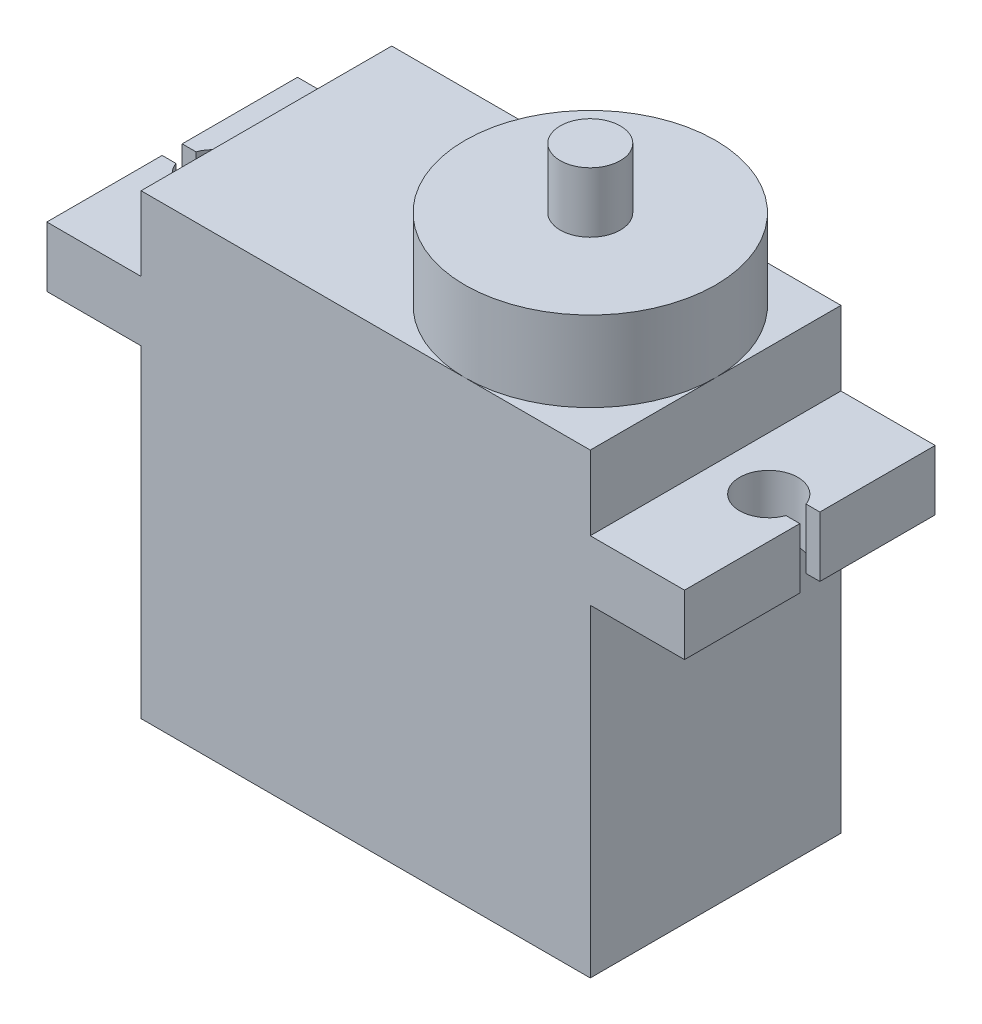
ISO-10303-21;
HEADER;
FILE_DESCRIPTION(('STEP AP214'),'2;1');
FILE_NAME('part.step','',(''),(''),'','','');
FILE_SCHEMA(('AUTOMOTIVE_DESIGN { 1 0 10303 214 1 1 1 1 }'));
ENDSEC;
DATA;
#1=APPLICATION_CONTEXT('core data for automotive mechanical design processes');
#2=APPLICATION_PROTOCOL_DEFINITION('international standard','automotive_design',2000,#1);
#3=PRODUCT_CONTEXT('',#1,'mechanical');
#4=PRODUCT('Part','Part','',(#3));
#5=PRODUCT_RELATED_PRODUCT_CATEGORY('part','',(#4));
#6=PRODUCT_DEFINITION_FORMATION('','',#4);
#7=PRODUCT_DEFINITION_CONTEXT('part definition',#1,'design');
#8=PRODUCT_DEFINITION('design','',#6,#7);
#9=PRODUCT_DEFINITION_SHAPE('','',#8);
#10=(LENGTH_UNIT() NAMED_UNIT(*) SI_UNIT(.MILLI.,.METRE.));
#11=(NAMED_UNIT(*) PLANE_ANGLE_UNIT() SI_UNIT($,.RADIAN.));
#12=(NAMED_UNIT(*) SI_UNIT($,.STERADIAN.) SOLID_ANGLE_UNIT());
#13=UNCERTAINTY_MEASURE_WITH_UNIT(LENGTH_MEASURE(1.E-05),#10,'distance_accuracy_value','');
#14=(GEOMETRIC_REPRESENTATION_CONTEXT(3) GLOBAL_UNCERTAINTY_ASSIGNED_CONTEXT((#13)) GLOBAL_UNIT_ASSIGNED_CONTEXT((#10,
#11,#12)) REPRESENTATION_CONTEXT('',''));
#15=CARTESIAN_POINT('',(0.,0.,0.));
#16=DIRECTION('',(0.,0.,1.));
#17=DIRECTION('',(1.,0.,0.));
#18=AXIS2_PLACEMENT_3D('',#15,#16,#17);
#19=CARTESIAN_POINT('',(-11.2,11.4,12.5));
#20=DIRECTION('',(0.,-1.,0.));
#21=DIRECTION('',(1.,0.,0.));
#22=AXIS2_PLACEMENT_3D('',#19,#20,#21);
#23=PLANE('',#22);
#24=CARTESIAN_POINT('',(4.95000000000001,11.4,6.25));
#25=DIRECTION('',(0.,1.,0.));
#26=DIRECTION('',(-1.,0.,0.));
#27=AXIS2_PLACEMENT_3D('',#24,#25,#26);
#28=CIRCLE('',#27,6.25);
#29=CARTESIAN_POINT('',(4.95000000000001,11.4,12.5));
#30=VERTEX_POINT('',#29);
#31=CARTESIAN_POINT('',(11.2,11.4,6.25));
#32=VERTEX_POINT('',#31);
#33=EDGE_CURVE('E43',#30,#32,#28,.T.);
#34=ORIENTED_EDGE('',*,*,#33,.F.);
#35=DIRECTION('',(-1.,0.,0.));
#36=VECTOR('',#35,1.);
#37=CARTESIAN_POINT('',(-11.2,11.4,12.5));
#38=LINE('',#37,#36);
#39=CARTESIAN_POINT('',(11.2,11.4,12.5));
#40=VERTEX_POINT('',#39);
#41=EDGE_CURVE('E179',#40,#30,#38,.T.);
#42=ORIENTED_EDGE('',*,*,#41,.F.);
#43=DIRECTION('',(0.,0.,-1.));
#44=VECTOR('',#43,1.);
#45=CARTESIAN_POINT('',(11.2,11.4,12.5));
#46=LINE('',#45,#44);
#47=EDGE_CURVE('E197',#40,#32,#46,.T.);
#48=ORIENTED_EDGE('',*,*,#47,.T.);
#49=EDGE_LOOP('',(#34,#42,#48));
#50=FACE_BOUND('',#49,.T.);
#51=ADVANCED_FACE('F32',(#50),#23,.F.);
#52=CARTESIAN_POINT('',(4.95000000000001,11.4,0.));
#53=VERTEX_POINT('',#52);
#54=EDGE_CURVE('E11',#32,#53,#28,.T.);
#55=ORIENTED_EDGE('',*,*,#54,.F.);
#56=CARTESIAN_POINT('',(11.2,11.4,0.));
#57=VERTEX_POINT('',#56);
#58=EDGE_CURVE('E330',#32,#57,#46,.T.);
#59=ORIENTED_EDGE('',*,*,#58,.T.);
#60=DIRECTION('',(-1.,0.,0.));
#61=VECTOR('',#60,1.);
#62=CARTESIAN_POINT('',(-11.2,11.4,0.));
#63=LINE('',#62,#61);
#64=EDGE_CURVE('E295',#57,#53,#63,.T.);
#65=ORIENTED_EDGE('',*,*,#64,.T.);
#66=EDGE_LOOP('',(#55,#59,#65));
#67=FACE_BOUND('',#66,.T.);
#68=ADVANCED_FACE('F364',(#67),#23,.F.);
#69=CARTESIAN_POINT('',(11.2,4.69999999999999,12.5));
#70=DIRECTION('',(0.,1.,0.));
#71=DIRECTION('',(-1.,0.,0.));
#72=AXIS2_PLACEMENT_3D('',#69,#70,#71);
#73=PLANE('',#72);
#74=DIRECTION('',(1.,0.,0.));
#75=VECTOR('',#74,1.);
#76=CARTESIAN_POINT('',(15.2110657588816,4.69999999999999,6.75));
#77=LINE('',#76,#75);
#78=CARTESIAN_POINT('',(15.2110657588816,4.69999999999999,6.75));
#79=VERTEX_POINT('',#78);
#80=CARTESIAN_POINT('',(15.9,4.69999999999999,6.75));
#81=VERTEX_POINT('',#80);
#82=EDGE_CURVE('E210',#79,#81,#77,.T.);
#83=ORIENTED_EDGE('',*,*,#82,.T.);
#84=DIRECTION('',(0.,0.,-1.));
#85=VECTOR('',#84,1.);
#86=CARTESIAN_POINT('',(15.9,4.69999999999999,12.5));
#87=LINE('',#86,#85);
#88=CARTESIAN_POINT('',(15.9,4.69999999999999,12.5));
#89=VERTEX_POINT('',#88);
#90=EDGE_CURVE('E203',#89,#81,#87,.T.);
#91=ORIENTED_EDGE('',*,*,#90,.F.);
#92=DIRECTION('',(1.,0.,0.));
#93=VECTOR('',#92,1.);
#94=CARTESIAN_POINT('',(11.2,4.69999999999999,12.5));
#95=LINE('',#94,#93);
#96=CARTESIAN_POINT('',(11.2,4.69999999999999,12.5));
#97=VERTEX_POINT('',#96);
#98=EDGE_CURVE('E261',#97,#89,#95,.T.);
#99=ORIENTED_EDGE('',*,*,#98,.F.);
#100=DIRECTION('',(0.,0.,-1.));
#101=VECTOR('',#100,1.);
#102=CARTESIAN_POINT('',(11.2,4.69999999999999,12.5));
#103=LINE('',#102,#101);
#104=CARTESIAN_POINT('',(11.2,4.69999999999999,0.));
#105=VERTEX_POINT('',#104);
#106=EDGE_CURVE('E36',#97,#105,#103,.T.);
#107=ORIENTED_EDGE('',*,*,#106,.T.);
#108=DIRECTION('',(1.,0.,0.));
#109=VECTOR('',#108,1.);
#110=CARTESIAN_POINT('',(11.2,4.69999999999999,0.));
#111=LINE('',#110,#109);
#112=CARTESIAN_POINT('',(15.9,4.69999999999999,0.));
#113=VERTEX_POINT('',#112);
#114=EDGE_CURVE('E283',#105,#113,#111,.T.);
#115=ORIENTED_EDGE('',*,*,#114,.T.);
#116=CARTESIAN_POINT('',(15.9,4.69999999999999,5.75));
#117=VERTEX_POINT('',#116);
#118=EDGE_CURVE('E338',#117,#113,#87,.T.);
#119=ORIENTED_EDGE('',*,*,#118,.F.);
#120=DIRECTION('',(-1.,0.,0.));
#121=VECTOR('',#120,1.);
#122=CARTESIAN_POINT('',(15.2110657588816,4.69999999999999,5.75));
#123=LINE('',#122,#121);
#124=CARTESIAN_POINT('',(15.2110657588816,4.69999999999999,5.75));
#125=VERTEX_POINT('',#124);
#126=EDGE_CURVE('E226',#117,#125,#123,.T.);
#127=ORIENTED_EDGE('',*,*,#126,.T.);
#128=CARTESIAN_POINT('',(13.85,4.69999999999999,6.25));
#129=DIRECTION('',(0.,1.,0.));
#130=DIRECTION('',(-1.,0.,0.));
#131=AXIS2_PLACEMENT_3D('',#128,#129,#130);
#132=CIRCLE('',#131,1.45);
#133=EDGE_CURVE('E207',#125,#79,#132,.T.);
#134=ORIENTED_EDGE('',*,*,#133,.T.);
#135=EDGE_LOOP('',(#83,#91,#99,#107,#115,#119,#127,#134));
#136=FACE_BOUND('',#135,.T.);
#137=ADVANCED_FACE('F351',(#136),#73,.F.);
#138=CARTESIAN_POINT('',(15.9,4.69999999999999,12.5));
#139=DIRECTION('',(-1.,0.,0.));
#140=DIRECTION('',(0.,0.,1.));
#141=AXIS2_PLACEMENT_3D('',#138,#139,#140);
#142=PLANE('',#141);
#143=DIRECTION('',(0.,1.,0.));
#144=VECTOR('',#143,1.);
#145=CARTESIAN_POINT('',(15.9,-11.401,6.75));
#146=LINE('',#145,#144);
#147=CARTESIAN_POINT('',(15.9,7.69999999999999,6.75));
#148=VERTEX_POINT('',#147);
#149=EDGE_CURVE('E223',#81,#148,#146,.T.);
#150=ORIENTED_EDGE('',*,*,#149,.T.);
#151=DIRECTION('',(0.,0.,-1.));
#152=VECTOR('',#151,1.);
#153=CARTESIAN_POINT('',(15.9,7.69999999999999,12.5));
#154=LINE('',#153,#152);
#155=CARTESIAN_POINT('',(15.9,7.69999999999999,12.5));
#156=VERTEX_POINT('',#155);
#157=EDGE_CURVE('E336',#156,#148,#154,.T.);
#158=ORIENTED_EDGE('',*,*,#157,.F.);
#159=DIRECTION('',(0.,1.,0.));
#160=VECTOR('',#159,1.);
#161=CARTESIAN_POINT('',(15.9,4.69999999999999,12.5));
#162=LINE('',#161,#160);
#163=EDGE_CURVE('E264',#89,#156,#162,.T.);
#164=ORIENTED_EDGE('',*,*,#163,.F.);
#165=ORIENTED_EDGE('',*,*,#90,.T.);
#166=EDGE_LOOP('',(#150,#158,#164,#165));
#167=FACE_BOUND('',#166,.T.);
#168=ADVANCED_FACE('F401',(#167),#142,.F.);
#169=DIRECTION('',(0.,1.,0.));
#170=VECTOR('',#169,1.);
#171=CARTESIAN_POINT('',(15.9,-11.401,5.75));
#172=LINE('',#171,#170);
#173=CARTESIAN_POINT('',(15.9,7.69999999999999,5.75));
#174=VERTEX_POINT('',#173);
#175=EDGE_CURVE('E222',#117,#174,#172,.T.);
#176=ORIENTED_EDGE('',*,*,#175,.F.);
#177=ORIENTED_EDGE('',*,*,#118,.T.);
#178=DIRECTION('',(0.,1.,0.));
#179=VECTOR('',#178,1.);
#180=CARTESIAN_POINT('',(15.9,4.69999999999999,0.));
#181=LINE('',#180,#179);
#182=CARTESIAN_POINT('',(15.9,7.69999999999999,0.));
#183=VERTEX_POINT('',#182);
#184=EDGE_CURVE('E286',#113,#183,#181,.T.);
#185=ORIENTED_EDGE('',*,*,#184,.T.);
#186=EDGE_CURVE('E335',#174,#183,#154,.T.);
#187=ORIENTED_EDGE('',*,*,#186,.F.);
#188=EDGE_LOOP('',(#176,#177,#185,#187));
#189=FACE_BOUND('',#188,.T.);
#190=ADVANCED_FACE('F346',(#189),#142,.F.);
#191=CARTESIAN_POINT('',(11.2,7.69999999999999,12.5));
#192=DIRECTION('',(0.,-1.,0.));
#193=DIRECTION('',(1.,0.,0.));
#194=AXIS2_PLACEMENT_3D('',#191,#192,#193);
#195=PLANE('',#194);
#196=DIRECTION('',(-1.,0.,0.));
#197=VECTOR('',#196,1.);
#198=CARTESIAN_POINT('',(15.2110657588816,7.69999999999999,6.75));
#199=LINE('',#198,#197);
#200=CARTESIAN_POINT('',(15.2110657588816,7.69999999999999,6.75));
#201=VERTEX_POINT('',#200);
#202=EDGE_CURVE('E219',#148,#201,#199,.T.);
#203=ORIENTED_EDGE('',*,*,#202,.T.);
#204=CARTESIAN_POINT('',(13.85,7.69999999999999,6.25));
#205=DIRECTION('',(0.,-1.,0.));
#206=DIRECTION('',(1.,0.,0.));
#207=AXIS2_PLACEMENT_3D('',#204,#205,#206);
#208=CIRCLE('',#207,1.45);
#209=CARTESIAN_POINT('',(15.2110657588816,7.69999999999999,5.75));
#210=VERTEX_POINT('',#209);
#211=EDGE_CURVE('E216',#201,#210,#208,.T.);
#212=ORIENTED_EDGE('',*,*,#211,.T.);
#213=DIRECTION('',(1.,0.,0.));
#214=VECTOR('',#213,1.);
#215=CARTESIAN_POINT('',(15.2110657588816,7.69999999999999,5.75));
#216=LINE('',#215,#214);
#217=EDGE_CURVE('E213',#210,#174,#216,.T.);
#218=ORIENTED_EDGE('',*,*,#217,.T.);
#219=ORIENTED_EDGE('',*,*,#186,.T.);
#220=DIRECTION('',(-1.,0.,0.));
#221=VECTOR('',#220,1.);
#222=CARTESIAN_POINT('',(11.2,7.69999999999999,0.));
#223=LINE('',#222,#221);
#224=CARTESIAN_POINT('',(11.2,7.69999999999999,0.));
#225=VERTEX_POINT('',#224);
#226=EDGE_CURVE('E289',#183,#225,#223,.T.);
#227=ORIENTED_EDGE('',*,*,#226,.T.);
#228=DIRECTION('',(0.,0.,-1.));
#229=VECTOR('',#228,1.);
#230=CARTESIAN_POINT('',(11.2,7.69999999999999,12.5));
#231=LINE('',#230,#229);
#232=CARTESIAN_POINT('',(11.2,7.69999999999999,12.5));
#233=VERTEX_POINT('',#232);
#234=EDGE_CURVE('E332',#233,#225,#231,.T.);
#235=ORIENTED_EDGE('',*,*,#234,.F.);
#236=DIRECTION('',(-1.,0.,0.));
#237=VECTOR('',#236,1.);
#238=CARTESIAN_POINT('',(11.2,7.69999999999999,12.5));
#239=LINE('',#238,#237);
#240=EDGE_CURVE('E266',#156,#233,#239,.T.);
#241=ORIENTED_EDGE('',*,*,#240,.F.);
#242=ORIENTED_EDGE('',*,*,#157,.T.);
#243=EDGE_LOOP('',(#203,#212,#218,#219,#227,#235,#241,#242));
#244=FACE_BOUND('',#243,.T.);
#245=ADVANCED_FACE('F360',(#244),#195,.F.);
#246=CARTESIAN_POINT('',(-15.9,4.69999999999999,12.5));
#247=DIRECTION('',(1.,0.,0.));
#248=DIRECTION('',(0.,0.,-1.));
#249=AXIS2_PLACEMENT_3D('',#246,#247,#248);
#250=PLANE('',#249);
#251=DIRECTION('',(0.,0.,-1.));
#252=VECTOR('',#251,1.);
#253=CARTESIAN_POINT('',(-15.9,4.69999999999999,12.5));
#254=LINE('',#253,#252);
#255=CARTESIAN_POINT('',(-15.9,4.69999999999998,5.75));
#256=VERTEX_POINT('',#255);
#257=CARTESIAN_POINT('',(-15.9,4.69999999999999,0.));
#258=VERTEX_POINT('',#257);
#259=EDGE_CURVE('E318',#256,#258,#254,.T.);
#260=ORIENTED_EDGE('',*,*,#259,.F.);
#261=DIRECTION('',(0.,1.,0.));
#262=VECTOR('',#261,1.);
#263=CARTESIAN_POINT('',(-15.9,-11.401,5.75));
#264=LINE('',#263,#262);
#265=CARTESIAN_POINT('',(-15.9,7.69999999999999,5.75));
#266=VERTEX_POINT('',#265);
#267=EDGE_CURVE('E248',#256,#266,#264,.T.);
#268=ORIENTED_EDGE('',*,*,#267,.T.);
#269=DIRECTION('',(0.,0.,-1.));
#270=VECTOR('',#269,1.);
#271=CARTESIAN_POINT('',(-15.9,7.69999999999999,12.5));
#272=LINE('',#271,#270);
#273=CARTESIAN_POINT('',(-15.9,7.69999999999999,0.));
#274=VERTEX_POINT('',#273);
#275=EDGE_CURVE('E322',#266,#274,#272,.T.);
#276=ORIENTED_EDGE('',*,*,#275,.T.);
#277=DIRECTION('',(0.,-1.,0.));
#278=VECTOR('',#277,1.);
#279=CARTESIAN_POINT('',(-15.9,4.69999999999999,0.));
#280=LINE('',#279,#278);
#281=EDGE_CURVE('E302',#274,#258,#280,.T.);
#282=ORIENTED_EDGE('',*,*,#281,.T.);
#283=EDGE_LOOP('',(#260,#268,#276,#282));
#284=FACE_BOUND('',#283,.T.);
#285=ADVANCED_FACE('F438',(#284),#250,.F.);
#286=CARTESIAN_POINT('',(11.2,4.69999999999999,12.5));
#287=DIRECTION('',(-1.,0.,0.));
#288=DIRECTION('',(0.,-1.,0.));
#289=AXIS2_PLACEMENT_3D('',#286,#287,#288);
#290=PLANE('',#289);
#291=DIRECTION('',(0.,1.,0.));
#292=VECTOR('',#291,1.);
#293=CARTESIAN_POINT('',(11.2,4.69999999999999,0.));
#294=LINE('',#293,#292);
#295=CARTESIAN_POINT('',(11.2,-11.4,0.));
#296=VERTEX_POINT('',#295);
#297=EDGE_CURVE('E258',#296,#105,#294,.T.);
#298=ORIENTED_EDGE('',*,*,#297,.T.);
#299=ORIENTED_EDGE('',*,*,#106,.F.);
#300=DIRECTION('',(0.,1.,0.));
#301=VECTOR('',#300,1.);
#302=CARTESIAN_POINT('',(11.2,4.69999999999999,12.5));
#303=LINE('',#302,#301);
#304=CARTESIAN_POINT('',(11.2,-11.4,12.5));
#305=VERTEX_POINT('',#304);
#306=EDGE_CURVE('E259',#305,#97,#303,.T.);
#307=ORIENTED_EDGE('',*,*,#306,.F.);
#308=DIRECTION('',(0.,0.,-1.));
#309=VECTOR('',#308,1.);
#310=CARTESIAN_POINT('',(11.2,-11.4,12.5));
#311=LINE('',#310,#309);
#312=EDGE_CURVE('E280',#305,#296,#311,.T.);
#313=ORIENTED_EDGE('',*,*,#312,.T.);
#314=EDGE_LOOP('',(#298,#299,#307,#313));
#315=FACE_BOUND('',#314,.T.);
#316=ADVANCED_FACE('F34',(#315),#290,.F.);
#317=CARTESIAN_POINT('',(11.2,11.4,12.5));
#318=DIRECTION('',(-1.,0.,0.));
#319=DIRECTION('',(0.,-1.,0.));
#320=AXIS2_PLACEMENT_3D('',#317,#318,#319);
#321=PLANE('',#320);
#322=DIRECTION('',(0.,1.,0.));
#323=VECTOR('',#322,1.);
#324=CARTESIAN_POINT('',(11.2,11.4,0.));
#325=LINE('',#324,#323);
#326=EDGE_CURVE('E291',#225,#57,#325,.T.);
#327=ORIENTED_EDGE('',*,*,#326,.T.);
#328=ORIENTED_EDGE('',*,*,#58,.F.);
#329=ORIENTED_EDGE('',*,*,#47,.F.);
#330=DIRECTION('',(0.,1.,0.));
#331=VECTOR('',#330,1.);
#332=CARTESIAN_POINT('',(11.2,11.4,12.5));
#333=LINE('',#332,#331);
#334=EDGE_CURVE('E185',#233,#40,#333,.T.);
#335=ORIENTED_EDGE('',*,*,#334,.F.);
#336=ORIENTED_EDGE('',*,*,#234,.T.);
#337=EDGE_LOOP('',(#327,#328,#329,#335,#336));
#338=FACE_BOUND('',#337,.T.);
#339=ADVANCED_FACE('F363',(#338),#321,.F.);
#340=EDGE_CURVE('E41',#53,#30,#28,.T.);
#341=ORIENTED_EDGE('',*,*,#340,.F.);
#342=CARTESIAN_POINT('',(-11.2,11.4,0.));
#343=VERTEX_POINT('',#342);
#344=EDGE_CURVE('E294',#53,#343,#63,.T.);
#345=ORIENTED_EDGE('',*,*,#344,.T.);
#346=DIRECTION('',(0.,0.,-1.));
#347=VECTOR('',#346,1.);
#348=CARTESIAN_POINT('',(-11.2,11.4,12.5));
#349=LINE('',#348,#347);
#350=CARTESIAN_POINT('',(-11.2,11.4,12.5));
#351=VERTEX_POINT('',#350);
#352=EDGE_CURVE('E194',#351,#343,#349,.T.);
#353=ORIENTED_EDGE('',*,*,#352,.F.);
#354=EDGE_CURVE('E182',#30,#351,#38,.T.);
#355=ORIENTED_EDGE('',*,*,#354,.F.);
#356=EDGE_LOOP('',(#341,#345,#353,#355));
#357=FACE_BOUND('',#356,.T.);
#358=ADVANCED_FACE('F192',(#357),#23,.F.);
#359=CARTESIAN_POINT('',(-11.2,11.4,12.5));
#360=DIRECTION('',(1.,0.,0.));
#361=DIRECTION('',(0.,1.,0.));
#362=AXIS2_PLACEMENT_3D('',#359,#360,#361);
#363=PLANE('',#362);
#364=DIRECTION('',(0.,-1.,0.));
#365=VECTOR('',#364,1.);
#366=CARTESIAN_POINT('',(-11.2,11.4,0.));
#367=LINE('',#366,#365);
#368=CARTESIAN_POINT('',(-11.2,7.69999999999999,0.));
#369=VERTEX_POINT('',#368);
#370=EDGE_CURVE('E297',#343,#369,#367,.T.);
#371=ORIENTED_EDGE('',*,*,#370,.T.);
#372=DIRECTION('',(0.,0.,-1.));
#373=VECTOR('',#372,1.);
#374=CARTESIAN_POINT('',(-11.2,7.69999999999999,12.5));
#375=LINE('',#374,#373);
#376=CARTESIAN_POINT('',(-11.2,7.69999999999999,12.5));
#377=VERTEX_POINT('',#376);
#378=EDGE_CURVE('E326',#377,#369,#375,.T.);
#379=ORIENTED_EDGE('',*,*,#378,.F.);
#380=DIRECTION('',(0.,-1.,0.));
#381=VECTOR('',#380,1.);
#382=CARTESIAN_POINT('',(-11.2,11.4,12.5));
#383=LINE('',#382,#381);
#384=EDGE_CURVE('E190',#351,#377,#383,.T.);
#385=ORIENTED_EDGE('',*,*,#384,.F.);
#386=ORIENTED_EDGE('',*,*,#352,.T.);
#387=EDGE_LOOP('',(#371,#379,#385,#386));
#388=FACE_BOUND('',#387,.T.);
#389=ADVANCED_FACE('F368',(#388),#363,.F.);
#390=CARTESIAN_POINT('',(-11.2,7.69999999999999,12.5));
#391=DIRECTION('',(0.,-1.,0.));
#392=DIRECTION('',(1.,0.,0.));
#393=AXIS2_PLACEMENT_3D('',#390,#391,#392);
#394=PLANE('',#393);
#395=ORIENTED_EDGE('',*,*,#275,.F.);
#396=DIRECTION('',(-1.,0.,0.));
#397=VECTOR('',#396,1.);
#398=CARTESIAN_POINT('',(-15.2110657588816,7.69999999999999,5.75));
#399=LINE('',#398,#397);
#400=CARTESIAN_POINT('',(-15.2110657588816,7.69999999999999,5.75));
#401=VERTEX_POINT('',#400);
#402=EDGE_CURVE('E245',#401,#266,#399,.T.);
#403=ORIENTED_EDGE('',*,*,#402,.F.);
#404=CARTESIAN_POINT('',(-13.85,7.69999999999999,6.25));
#405=DIRECTION('',(0.,1.,0.));
#406=DIRECTION('',(-1.,0.,0.));
#407=AXIS2_PLACEMENT_3D('',#404,#405,#406);
#408=CIRCLE('',#407,1.45);
#409=CARTESIAN_POINT('',(-15.2110657588816,7.69999999999999,6.75));
#410=VERTEX_POINT('',#409);
#411=EDGE_CURVE('E242',#410,#401,#408,.T.);
#412=ORIENTED_EDGE('',*,*,#411,.F.);
#413=DIRECTION('',(1.,0.,0.));
#414=VECTOR('',#413,1.);
#415=CARTESIAN_POINT('',(-15.2110657588816,7.69999999999999,6.75));
#416=LINE('',#415,#414);
#417=CARTESIAN_POINT('',(-15.9,7.69999999999999,6.75));
#418=VERTEX_POINT('',#417);
#419=EDGE_CURVE('E239',#418,#410,#416,.T.);
#420=ORIENTED_EDGE('',*,*,#419,.F.);
#421=CARTESIAN_POINT('',(-15.9,7.69999999999999,12.5));
#422=VERTEX_POINT('',#421);
#423=EDGE_CURVE('E323',#422,#418,#272,.T.);
#424=ORIENTED_EDGE('',*,*,#423,.F.);
#425=DIRECTION('',(-1.,0.,0.));
#426=VECTOR('',#425,1.);
#427=CARTESIAN_POINT('',(-11.2,7.69999999999999,12.5));
#428=LINE('',#427,#426);
#429=EDGE_CURVE('E270',#377,#422,#428,.T.);
#430=ORIENTED_EDGE('',*,*,#429,.F.);
#431=ORIENTED_EDGE('',*,*,#378,.T.);
#432=DIRECTION('',(-1.,0.,0.));
#433=VECTOR('',#432,1.);
#434=CARTESIAN_POINT('',(-11.2,7.69999999999999,0.));
#435=LINE('',#434,#433);
#436=EDGE_CURVE('E299',#369,#274,#435,.T.);
#437=ORIENTED_EDGE('',*,*,#436,.T.);
#438=EDGE_LOOP('',(#395,#403,#412,#420,#424,#430,#431,#437));
#439=FACE_BOUND('',#438,.T.);
#440=ADVANCED_FACE('F377',(#439),#394,.F.);
#441=ORIENTED_EDGE('',*,*,#423,.T.);
#442=DIRECTION('',(0.,1.,0.));
#443=VECTOR('',#442,1.);
#444=CARTESIAN_POINT('',(-15.9,-11.401,6.75));
#445=LINE('',#444,#443);
#446=CARTESIAN_POINT('',(-15.9,4.69999999999999,6.75));
#447=VERTEX_POINT('',#446);
#448=EDGE_CURVE('E247',#447,#418,#445,.T.);
#449=ORIENTED_EDGE('',*,*,#448,.F.);
#450=CARTESIAN_POINT('',(-15.9,4.69999999999999,12.5));
#451=VERTEX_POINT('',#450);
#452=EDGE_CURVE('E319',#451,#447,#254,.T.);
#453=ORIENTED_EDGE('',*,*,#452,.F.);
#454=DIRECTION('',(0.,-1.,0.));
#455=VECTOR('',#454,1.);
#456=CARTESIAN_POINT('',(-15.9,4.69999999999999,12.5));
#457=LINE('',#456,#455);
#458=EDGE_CURVE('E272',#422,#451,#457,.T.);
#459=ORIENTED_EDGE('',*,*,#458,.F.);
#460=EDGE_LOOP('',(#441,#449,#453,#459));
#461=FACE_BOUND('',#460,.T.);
#462=ADVANCED_FACE('F381',(#461),#250,.F.);
#463=CARTESIAN_POINT('',(-11.2,4.69999999999999,12.5));
#464=DIRECTION('',(0.,1.,0.));
#465=DIRECTION('',(-1.,0.,0.));
#466=AXIS2_PLACEMENT_3D('',#463,#464,#465);
#467=PLANE('',#466);
#468=CARTESIAN_POINT('',(-13.85,4.69999999999998,6.25));
#469=DIRECTION('',(0.,1.,0.));
#470=DIRECTION('',(-1.,0.,0.));
#471=AXIS2_PLACEMENT_3D('',#468,#469,#470);
#472=CIRCLE('',#471,1.45);
#473=CARTESIAN_POINT('',(-15.2110657588816,4.69999999999998,5.75));
#474=VERTEX_POINT('',#473);
#475=CARTESIAN_POINT('',(-15.2110657588816,4.69999999999999,6.75));
#476=VERTEX_POINT('',#475);
#477=EDGE_CURVE('E234',#474,#476,#472,.F.);
#478=ORIENTED_EDGE('',*,*,#477,.F.);
#479=DIRECTION('',(1.,0.,0.));
#480=VECTOR('',#479,1.);
#481=CARTESIAN_POINT('',(-15.2110657588816,4.69999999999998,5.75));
#482=LINE('',#481,#480);
#483=EDGE_CURVE('E236',#256,#474,#482,.T.);
#484=ORIENTED_EDGE('',*,*,#483,.F.);
#485=ORIENTED_EDGE('',*,*,#259,.T.);
#486=DIRECTION('',(1.,0.,0.));
#487=VECTOR('',#486,1.);
#488=CARTESIAN_POINT('',(-11.2,4.69999999999999,0.));
#489=LINE('',#488,#487);
#490=CARTESIAN_POINT('',(-11.2,4.69999999999999,0.));
#491=VERTEX_POINT('',#490);
#492=EDGE_CURVE('E305',#258,#491,#489,.T.);
#493=ORIENTED_EDGE('',*,*,#492,.T.);
#494=DIRECTION('',(0.,0.,-1.));
#495=VECTOR('',#494,1.);
#496=CARTESIAN_POINT('',(-11.2,4.69999999999999,12.5));
#497=LINE('',#496,#495);
#498=CARTESIAN_POINT('',(-11.2,4.69999999999999,12.5));
#499=VERTEX_POINT('',#498);
#500=EDGE_CURVE('E315',#499,#491,#497,.T.);
#501=ORIENTED_EDGE('',*,*,#500,.F.);
#502=DIRECTION('',(1.,0.,0.));
#503=VECTOR('',#502,1.);
#504=CARTESIAN_POINT('',(-11.2,4.69999999999999,12.5));
#505=LINE('',#504,#503);
#506=EDGE_CURVE('E274',#451,#499,#505,.T.);
#507=ORIENTED_EDGE('',*,*,#506,.F.);
#508=ORIENTED_EDGE('',*,*,#452,.T.);
#509=DIRECTION('',(-1.,0.,0.));
#510=VECTOR('',#509,1.);
#511=CARTESIAN_POINT('',(-15.2110657588816,4.69999999999998,6.75));
#512=LINE('',#511,#510);
#513=EDGE_CURVE('E251',#476,#447,#512,.T.);
#514=ORIENTED_EDGE('',*,*,#513,.F.);
#515=EDGE_LOOP('',(#478,#484,#485,#493,#501,#507,#508,#514));
#516=FACE_BOUND('',#515,.T.);
#517=ADVANCED_FACE('F387',(#516),#467,.F.);
#518=CARTESIAN_POINT('',(-11.2,4.69999999999999,12.5));
#519=DIRECTION('',(1.,0.,0.));
#520=DIRECTION('',(0.,1.,0.));
#521=AXIS2_PLACEMENT_3D('',#518,#519,#520);
#522=PLANE('',#521);
#523=DIRECTION('',(0.,-1.,0.));
#524=VECTOR('',#523,1.);
#525=CARTESIAN_POINT('',(-11.2,4.69999999999999,0.));
#526=LINE('',#525,#524);
#527=CARTESIAN_POINT('',(-11.2,-11.4,0.));
#528=VERTEX_POINT('',#527);
#529=EDGE_CURVE('E307',#491,#528,#526,.T.);
#530=ORIENTED_EDGE('',*,*,#529,.T.);
#531=DIRECTION('',(0.,0.,-1.));
#532=VECTOR('',#531,1.);
#533=CARTESIAN_POINT('',(-11.2,-11.4,12.5));
#534=LINE('',#533,#532);
#535=CARTESIAN_POINT('',(-11.2,-11.4,12.5));
#536=VERTEX_POINT('',#535);
#537=EDGE_CURVE('E312',#536,#528,#534,.T.);
#538=ORIENTED_EDGE('',*,*,#537,.F.);
#539=DIRECTION('',(0.,-1.,0.));
#540=VECTOR('',#539,1.);
#541=CARTESIAN_POINT('',(-11.2,4.69999999999999,12.5));
#542=LINE('',#541,#540);
#543=EDGE_CURVE('E276',#499,#536,#542,.T.);
#544=ORIENTED_EDGE('',*,*,#543,.F.);
#545=ORIENTED_EDGE('',*,*,#500,.T.);
#546=EDGE_LOOP('',(#530,#538,#544,#545));
#547=FACE_BOUND('',#546,.T.);
#548=ADVANCED_FACE('F393',(#547),#522,.F.);
#549=CARTESIAN_POINT('',(-11.2,-11.4,12.5));
#550=DIRECTION('',(0.,1.,0.));
#551=DIRECTION('',(0.,0.,1.));
#552=AXIS2_PLACEMENT_3D('',#549,#550,#551);
#553=PLANE('',#552);
#554=DIRECTION('',(1.,0.,0.));
#555=VECTOR('',#554,1.);
#556=CARTESIAN_POINT('',(-11.2,-11.4,0.));
#557=LINE('',#556,#555);
#558=EDGE_CURVE('E262',#528,#296,#557,.T.);
#559=ORIENTED_EDGE('',*,*,#558,.T.);
#560=ORIENTED_EDGE('',*,*,#312,.F.);
#561=DIRECTION('',(1.,0.,0.));
#562=VECTOR('',#561,1.);
#563=CARTESIAN_POINT('',(-11.2,-11.4,12.5));
#564=LINE('',#563,#562);
#565=EDGE_CURVE('E278',#536,#305,#564,.T.);
#566=ORIENTED_EDGE('',*,*,#565,.F.);
#567=ORIENTED_EDGE('',*,*,#537,.T.);
#568=EDGE_LOOP('',(#559,#560,#566,#567));
#569=FACE_BOUND('',#568,.T.);
#570=ADVANCED_FACE('F397',(#569),#553,.F.);
#571=CARTESIAN_POINT('',(0.,0.,12.5));
#572=DIRECTION('',(0.,0.,1.));
#573=DIRECTION('',(1.,0.,0.));
#574=AXIS2_PLACEMENT_3D('',#571,#572,#573);
#575=PLANE('',#574);
#576=ORIENTED_EDGE('',*,*,#306,.T.);
#577=ORIENTED_EDGE('',*,*,#98,.T.);
#578=ORIENTED_EDGE('',*,*,#163,.T.);
#579=ORIENTED_EDGE('',*,*,#240,.T.);
#580=ORIENTED_EDGE('',*,*,#334,.T.);
#581=ORIENTED_EDGE('',*,*,#41,.T.);
#582=ORIENTED_EDGE('',*,*,#354,.T.);
#583=ORIENTED_EDGE('',*,*,#384,.T.);
#584=ORIENTED_EDGE('',*,*,#429,.T.);
#585=ORIENTED_EDGE('',*,*,#458,.T.);
#586=ORIENTED_EDGE('',*,*,#506,.T.);
#587=ORIENTED_EDGE('',*,*,#543,.T.);
#588=ORIENTED_EDGE('',*,*,#565,.T.);
#589=EDGE_LOOP('',(#576,#577,#578,#579,#580,#581,#582,#583,#584,#585,#586,#587,#588));
#590=FACE_BOUND('',#589,.T.);
#591=ADVANCED_FACE('F181',(#590),#575,.T.);
#592=CARTESIAN_POINT('',(0.,0.,0.));
#593=DIRECTION('',(0.,0.,1.));
#594=DIRECTION('',(1.,0.,0.));
#595=AXIS2_PLACEMENT_3D('',#592,#593,#594);
#596=PLANE('',#595);
#597=ORIENTED_EDGE('',*,*,#297,.F.);
#598=ORIENTED_EDGE('',*,*,#558,.F.);
#599=ORIENTED_EDGE('',*,*,#529,.F.);
#600=ORIENTED_EDGE('',*,*,#492,.F.);
#601=ORIENTED_EDGE('',*,*,#281,.F.);
#602=ORIENTED_EDGE('',*,*,#436,.F.);
#603=ORIENTED_EDGE('',*,*,#370,.F.);
#604=ORIENTED_EDGE('',*,*,#344,.F.);
#605=ORIENTED_EDGE('',*,*,#64,.F.);
#606=ORIENTED_EDGE('',*,*,#326,.F.);
#607=ORIENTED_EDGE('',*,*,#226,.F.);
#608=ORIENTED_EDGE('',*,*,#184,.F.);
#609=ORIENTED_EDGE('',*,*,#114,.F.);
#610=EDGE_LOOP('',(#597,#598,#599,#600,#601,#602,#603,#604,#605,#606,#607,#608,#609));
#611=FACE_BOUND('',#610,.T.);
#612=ADVANCED_FACE('F355',(#611),#596,.F.);
#613=CARTESIAN_POINT('',(-15.2110657588816,-11.401,5.75));
#614=DIRECTION('',(0.,0.,-1.));
#615=DIRECTION('',(-1.,0.,0.));
#616=AXIS2_PLACEMENT_3D('',#613,#614,#615);
#617=PLANE('',#616);
#618=ORIENTED_EDGE('',*,*,#483,.T.);
#619=DIRECTION('',(0.,1.,0.));
#620=VECTOR('',#619,1.);
#621=CARTESIAN_POINT('',(-15.2110657588816,-11.401,5.75));
#622=LINE('',#621,#620);
#623=EDGE_CURVE('E252',#474,#401,#622,.T.);
#624=ORIENTED_EDGE('',*,*,#623,.T.);
#625=ORIENTED_EDGE('',*,*,#402,.T.);
#626=ORIENTED_EDGE('',*,*,#267,.F.);
#627=EDGE_LOOP('',(#618,#624,#625,#626));
#628=FACE_BOUND('',#627,.T.);
#629=ADVANCED_FACE('F517',(#628),#617,.F.);
#630=CARTESIAN_POINT('',(-13.85,-11.401,6.25));
#631=DIRECTION('',(0.,1.,0.));
#632=DIRECTION('',(-1.,0.,0.));
#633=AXIS2_PLACEMENT_3D('',#630,#631,#632);
#634=CYLINDRICAL_SURFACE('',#633,1.45);
#635=ORIENTED_EDGE('',*,*,#477,.T.);
#636=DIRECTION('',(0.,1.,0.));
#637=VECTOR('',#636,1.);
#638=CARTESIAN_POINT('',(-15.2110657588816,-11.401,6.75));
#639=LINE('',#638,#637);
#640=EDGE_CURVE('E254',#476,#410,#639,.T.);
#641=ORIENTED_EDGE('',*,*,#640,.T.);
#642=ORIENTED_EDGE('',*,*,#411,.T.);
#643=ORIENTED_EDGE('',*,*,#623,.F.);
#644=EDGE_LOOP('',(#635,#641,#642,#643));
#645=FACE_BOUND('',#644,.T.);
#646=ADVANCED_FACE('F525',(#645),#634,.F.);
#647=CARTESIAN_POINT('',(-15.2110657588816,-11.401,6.75));
#648=DIRECTION('',(0.,0.,1.));
#649=DIRECTION('',(1.,0.,0.));
#650=AXIS2_PLACEMENT_3D('',#647,#648,#649);
#651=PLANE('',#650);
#652=ORIENTED_EDGE('',*,*,#513,.T.);
#653=ORIENTED_EDGE('',*,*,#448,.T.);
#654=ORIENTED_EDGE('',*,*,#419,.T.);
#655=ORIENTED_EDGE('',*,*,#640,.F.);
#656=EDGE_LOOP('',(#652,#653,#654,#655));
#657=FACE_BOUND('',#656,.T.);
#658=ADVANCED_FACE('F533',(#657),#651,.F.);
#659=CARTESIAN_POINT('',(15.2110657588816,-11.401,6.75));
#660=DIRECTION('',(0.,0.,-1.));
#661=DIRECTION('',(-1.,0.,0.));
#662=AXIS2_PLACEMENT_3D('',#659,#660,#661);
#663=PLANE('',#662);
#664=DIRECTION('',(0.,1.,0.));
#665=VECTOR('',#664,1.);
#666=CARTESIAN_POINT('',(15.2110657588816,-11.401,6.75));
#667=LINE('',#666,#665);
#668=EDGE_CURVE('E227',#79,#201,#667,.T.);
#669=ORIENTED_EDGE('',*,*,#668,.T.);
#670=ORIENTED_EDGE('',*,*,#202,.F.);
#671=ORIENTED_EDGE('',*,*,#149,.F.);
#672=ORIENTED_EDGE('',*,*,#82,.F.);
#673=EDGE_LOOP('',(#669,#670,#671,#672));
#674=FACE_BOUND('',#673,.T.);
#675=ADVANCED_FACE('F404',(#674),#663,.T.);
#676=CARTESIAN_POINT('',(13.85,-11.401,6.25));
#677=DIRECTION('',(0.,1.,0.));
#678=DIRECTION('',(-1.,0.,0.));
#679=AXIS2_PLACEMENT_3D('',#676,#677,#678);
#680=CYLINDRICAL_SURFACE('',#679,1.45);
#681=DIRECTION('',(0.,1.,0.));
#682=VECTOR('',#681,1.);
#683=CARTESIAN_POINT('',(15.2110657588816,-11.401,5.75));
#684=LINE('',#683,#682);
#685=EDGE_CURVE('E229',#125,#210,#684,.T.);
#686=ORIENTED_EDGE('',*,*,#685,.T.);
#687=ORIENTED_EDGE('',*,*,#211,.F.);
#688=ORIENTED_EDGE('',*,*,#668,.F.);
#689=ORIENTED_EDGE('',*,*,#133,.F.);
#690=EDGE_LOOP('',(#686,#687,#688,#689));
#691=FACE_BOUND('',#690,.T.);
#692=ADVANCED_FACE('F407',(#691),#680,.F.);
#693=CARTESIAN_POINT('',(15.2110657588816,-11.401,5.75));
#694=DIRECTION('',(0.,0.,1.));
#695=DIRECTION('',(1.,0.,0.));
#696=AXIS2_PLACEMENT_3D('',#693,#694,#695);
#697=PLANE('',#696);
#698=ORIENTED_EDGE('',*,*,#175,.T.);
#699=ORIENTED_EDGE('',*,*,#217,.F.);
#700=ORIENTED_EDGE('',*,*,#685,.F.);
#701=ORIENTED_EDGE('',*,*,#126,.F.);
#702=EDGE_LOOP('',(#698,#699,#700,#701));
#703=FACE_BOUND('',#702,.T.);
#704=ADVANCED_FACE('F411',(#703),#697,.T.);
#705=CARTESIAN_POINT('',(4.95000000000001,15.4,6.25));
#706=DIRECTION('',(0.,-1.,0.));
#707=DIRECTION('',(1.,0.,0.));
#708=AXIS2_PLACEMENT_3D('',#705,#706,#707);
#709=CYLINDRICAL_SURFACE('',#708,6.25);
#710=CARTESIAN_POINT('',(4.95000000000001,15.4,6.25));
#711=DIRECTION('',(0.,1.,0.));
#712=DIRECTION('',(-1.,0.,0.));
#713=AXIS2_PLACEMENT_3D('',#710,#711,#712);
#714=CIRCLE('',#713,6.25);
#715=CARTESIAN_POINT('',(-1.29999999999999,15.4,6.25));
#716=VERTEX_POINT('',#715);
#717=EDGE_CURVE('E199',#716,#716,#714,.T.);
#718=ORIENTED_EDGE('',*,*,#717,.F.);
#719=EDGE_LOOP('',(#718));
#720=FACE_BOUND('',#719,.T.);
#721=ORIENTED_EDGE('',*,*,#33,.T.);
#722=ORIENTED_EDGE('',*,*,#54,.T.);
#723=ORIENTED_EDGE('',*,*,#340,.T.);
#724=EDGE_LOOP('',(#721,#722,#723));
#725=FACE_BOUND('',#724,.T.);
#726=ADVANCED_FACE('F201',(#720,#725),#709,.T.);
#727=CARTESIAN_POINT('',(4.95000000000001,15.4,6.25));
#728=DIRECTION('',(0.,1.,0.));
#729=DIRECTION('',(-1.,0.,0.));
#730=AXIS2_PLACEMENT_3D('',#727,#728,#729);
#731=PLANE('',#730);
#732=CARTESIAN_POINT('',(4.95000000000001,15.4,6.25));
#733=DIRECTION('',(0.,1.,0.));
#734=DIRECTION('',(-1.,0.,0.));
#735=AXIS2_PLACEMENT_3D('',#732,#733,#734);
#736=CIRCLE('',#735,1.5);
#737=CARTESIAN_POINT('',(3.45000000000001,15.4,6.25));
#738=VERTEX_POINT('',#737);
#739=EDGE_CURVE('E608',#738,#738,#736,.T.);
#740=ORIENTED_EDGE('',*,*,#739,.F.);
#741=EDGE_LOOP('',(#740));
#742=FACE_BOUND('',#741,.T.);
#743=ORIENTED_EDGE('',*,*,#717,.T.);
#744=EDGE_LOOP('',(#743));
#745=FACE_BOUND('',#744,.T.);
#746=ADVANCED_FACE('F418',(#742,#745),#731,.T.);
#747=CARTESIAN_POINT('',(4.95,18.4,6.25));
#748=DIRECTION('',(0.,-1.,0.));
#749=DIRECTION('',(1.,0.,0.));
#750=AXIS2_PLACEMENT_3D('',#747,#748,#749);
#751=CYLINDRICAL_SURFACE('',#750,1.5);
#752=CARTESIAN_POINT('',(4.95,18.4,6.25));
#753=DIRECTION('',(0.,1.,0.));
#754=DIRECTION('',(-1.,0.,0.));
#755=AXIS2_PLACEMENT_3D('',#752,#753,#754);
#756=CIRCLE('',#755,1.5);
#757=CARTESIAN_POINT('',(3.45000000000001,18.4,6.25));
#758=VERTEX_POINT('',#757);
#759=EDGE_CURVE('E200',#758,#758,#756,.T.);
#760=ORIENTED_EDGE('',*,*,#759,.F.);
#761=EDGE_LOOP('',(#760));
#762=FACE_BOUND('',#761,.T.);
#763=ORIENTED_EDGE('',*,*,#739,.T.);
#764=EDGE_LOOP('',(#763));
#765=FACE_BOUND('',#764,.T.);
#766=ADVANCED_FACE('F582',(#762,#765),#751,.T.);
#767=CARTESIAN_POINT('',(4.95,18.4,6.25));
#768=DIRECTION('',(0.,1.,0.));
#769=DIRECTION('',(-1.,0.,0.));
#770=AXIS2_PLACEMENT_3D('',#767,#768,#769);
#771=PLANE('',#770);
#772=ORIENTED_EDGE('',*,*,#759,.T.);
#773=EDGE_LOOP('',(#772));
#774=FACE_BOUND('',#773,.T.);
#775=ADVANCED_FACE('F591',(#774),#771,.T.);
#776=CLOSED_SHELL('',(#51,#68,#137,#168,#190,#245,#285,#316,#339,#358,#389,#440,#462,#517,#548,
#570,#591,#612,#629,#646,#658,#675,#692,#704,#726,#746,#766,#775));
#777=MANIFOLD_SOLID_BREP('B2',#776);
#778=ADVANCED_BREP_SHAPE_REPRESENTATION('',(#18,#777),#14);
#779=SHAPE_DEFINITION_REPRESENTATION(#9,#778);
ENDSEC;
END-ISO-10303-21;
